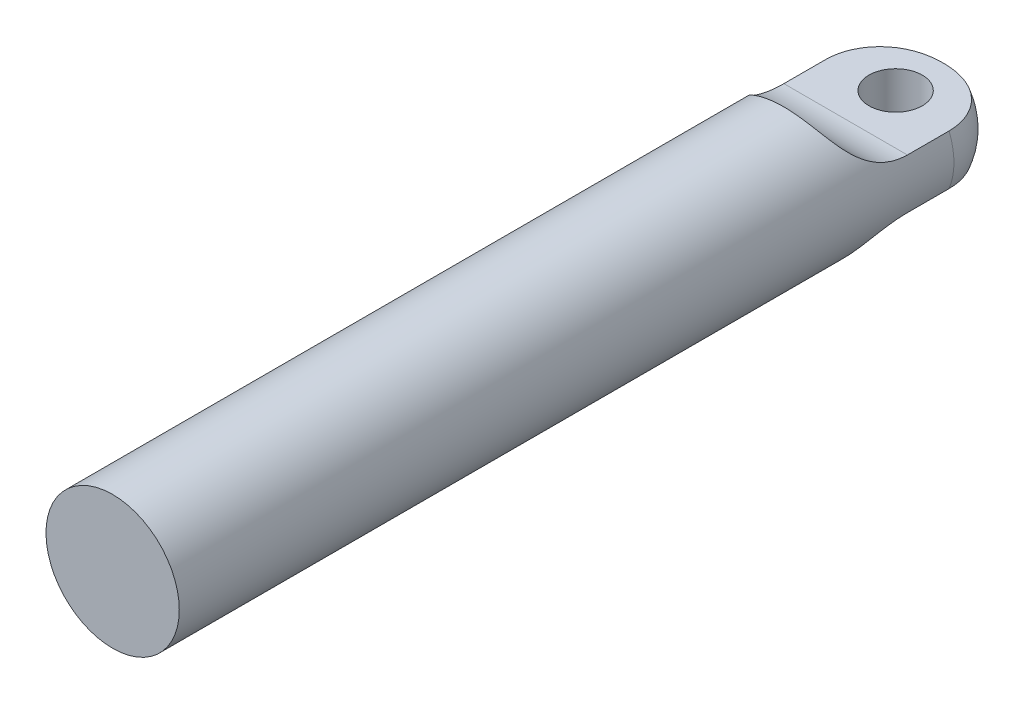
ISO-10303-21;
HEADER;
FILE_DESCRIPTION(('STEP AP214'),'2;1');
FILE_NAME('part.step','',(''),(''),'','','');
FILE_SCHEMA(('AUTOMOTIVE_DESIGN { 1 0 10303 214 1 1 1 1 }'));
ENDSEC;
DATA;
#1=APPLICATION_CONTEXT('core data for automotive mechanical design processes');
#2=APPLICATION_PROTOCOL_DEFINITION('international standard','automotive_design',2000,#1);
#3=PRODUCT_CONTEXT('',#1,'mechanical');
#4=PRODUCT('Part','Part','',(#3));
#5=PRODUCT_RELATED_PRODUCT_CATEGORY('part','',(#4));
#6=PRODUCT_DEFINITION_FORMATION('','',#4);
#7=PRODUCT_DEFINITION_CONTEXT('part definition',#1,'design');
#8=PRODUCT_DEFINITION('design','',#6,#7);
#9=PRODUCT_DEFINITION_SHAPE('','',#8);
#10=(LENGTH_UNIT() NAMED_UNIT(*) SI_UNIT(.MILLI.,.METRE.));
#11=(NAMED_UNIT(*) PLANE_ANGLE_UNIT() SI_UNIT($,.RADIAN.));
#12=(NAMED_UNIT(*) SI_UNIT($,.STERADIAN.) SOLID_ANGLE_UNIT());
#13=UNCERTAINTY_MEASURE_WITH_UNIT(LENGTH_MEASURE(1.E-05),#10,'distance_accuracy_value','');
#14=(GEOMETRIC_REPRESENTATION_CONTEXT(3) GLOBAL_UNCERTAINTY_ASSIGNED_CONTEXT((#13)) GLOBAL_UNIT_ASSIGNED_CONTEXT((#10,
#11,#12)) REPRESENTATION_CONTEXT('',''));
#15=CARTESIAN_POINT('',(0.,0.,0.));
#16=DIRECTION('',(0.,0.,1.));
#17=DIRECTION('',(1.,0.,0.));
#18=AXIS2_PLACEMENT_3D('',#15,#16,#17);
#19=CARTESIAN_POINT('',(0.,0.,25.));
#20=DIRECTION('',(0.,0.,-1.));
#21=DIRECTION('',(-1.,0.,0.));
#22=AXIS2_PLACEMENT_3D('',#19,#20,#21);
#23=CYLINDRICAL_SURFACE('',#22,4.);
#24=CARTESIAN_POINT('',(0.,0.,25.));
#25=DIRECTION('',(0.,0.,1.));
#26=DIRECTION('',(1.,0.,0.));
#27=AXIS2_PLACEMENT_3D('',#24,#25,#26);
#28=CIRCLE('',#27,4.);
#29=CARTESIAN_POINT('',(4.,0.,25.));
#30=VERTEX_POINT('',#29);
#31=EDGE_CURVE('E101',#30,#30,#28,.T.);
#32=ORIENTED_EDGE('',*,*,#31,.F.);
#33=EDGE_LOOP('',(#32));
#34=FACE_BOUND('',#33,.T.);
#35=DIRECTION('',(0.,0.,-1.));
#36=VECTOR('',#35,1.);
#37=CARTESIAN_POINT('',(3.70809924354783,-1.49999999999999,25.));
#38=LINE('',#37,#36);
#39=CARTESIAN_POINT('',(3.70809924354783,-1.49999999999999,-19.));
#40=VERTEX_POINT('',#39);
#41=CARTESIAN_POINT('',(3.70809924354783,-1.49999999999999,-21.5000000000012));
#42=VERTEX_POINT('',#41);
#43=EDGE_CURVE('E84',#40,#42,#38,.T.);
#44=ORIENTED_EDGE('',*,*,#43,.T.);
#45=CARTESIAN_POINT('',(0.,0.,-21.5));
#46=DIRECTION('',(0.,0.,1.));
#47=DIRECTION('',(1.,0.,0.));
#48=AXIS2_PLACEMENT_3D('',#45,#46,#47);
#49=CIRCLE('',#48,4.);
#50=CARTESIAN_POINT('',(3.70809924354783,1.49999999999999,-21.5));
#51=VERTEX_POINT('',#50);
#52=EDGE_CURVE('E172',#42,#51,#49,.T.);
#53=ORIENTED_EDGE('',*,*,#52,.T.);
#54=DIRECTION('',(0.,0.,-1.));
#55=VECTOR('',#54,1.);
#56=CARTESIAN_POINT('',(3.70809924354783,1.49999999999999,25.));
#57=LINE('',#56,#55);
#58=CARTESIAN_POINT('',(3.70809924354783,1.5,-19.));
#59=VERTEX_POINT('',#58);
#60=EDGE_CURVE('E97',#51,#59,#57,.F.);
#61=ORIENTED_EDGE('',*,*,#60,.T.);
#62=CARTESIAN_POINT('',(3.70809924354783,1.5,-19.));
#63=CARTESIAN_POINT('',(3.70807573141707,1.4999867045356,-18.8995519770718));
#64=CARTESIAN_POINT('',(3.70656787967163,1.50378316425376,-18.7991016473895));
#65=CARTESIAN_POINT('',(3.7004132093745,1.51890292125169,-18.5988495999316));
#66=CARTESIAN_POINT('',(3.69576587355285,1.53022745887322,-18.4990479917772));
#67=CARTESIAN_POINT('',(3.68314305806879,1.56035547785143,-18.30048466203));
#68=CARTESIAN_POINT('',(3.6751576990941,1.57918115198815,-18.2017269269216));
#69=CARTESIAN_POINT('',(3.65552611735579,1.62411009038121,-18.0062539467445));
#70=CARTESIAN_POINT('',(3.64388008648036,1.65021297316655,-17.9095385948999));
#71=CARTESIAN_POINT('',(3.61646295948721,1.70946243568066,-17.7186603632832));
#72=CARTESIAN_POINT('',(3.60068335632793,1.74262351473543,-17.624503194626));
#73=CARTESIAN_POINT('',(3.56447865743165,1.81552956246726,-17.4396980421763));
#74=CARTESIAN_POINT('',(3.5440539418243,1.85527399232799,-17.3490497719455));
#75=CARTESIAN_POINT('',(3.49800301857775,1.9407020056598,-17.1721518425613));
#76=CARTESIAN_POINT('',(3.47238520720236,1.98637595987267,-17.0858953608504));
#77=CARTESIAN_POINT('',(3.41532464021781,2.08295482787731,-16.918378888951));
#78=CARTESIAN_POINT('',(3.38388233359743,2.13385933833028,-16.8371185142739));
#79=CARTESIAN_POINT('',(3.31631987876816,2.23733046323938,-16.684165497106));
#80=CARTESIAN_POINT('',(3.2805062159358,2.28969188747336,-16.6121987788628));
#81=CARTESIAN_POINT('',(3.20271856607924,2.39728970279654,-16.4739637636468));
#82=CARTESIAN_POINT('',(3.16074480380171,2.45252598895111,-16.4076952589188));
#83=CARTESIAN_POINT('',(3.07040476715984,2.56472176521923,-16.2813090185243));
#84=CARTESIAN_POINT('',(3.02204096719011,2.62168058177264,-16.2211889179356));
#85=CARTESIAN_POINT('',(2.91883635411959,2.73611529488793,-16.1073445493086));
#86=CARTESIAN_POINT('',(2.86399601260519,2.79359115352043,-16.0536198161659));
#87=CARTESIAN_POINT('',(2.75341703443147,2.9024363019235,-15.9573964905092));
#88=CARTESIAN_POINT('',(2.69824690570962,2.95387196247428,-15.9143174029692));
#89=CARTESIAN_POINT('',(2.58288776713917,3.05525580849013,-15.8333874667218));
#90=CARTESIAN_POINT('',(2.52269706007911,3.10520348313278,-15.7955383976082));
#91=CARTESIAN_POINT('',(2.39764859050589,3.20274378036323,-15.7249059758699));
#92=CARTESIAN_POINT('',(2.33279180194646,3.25033689094048,-15.6921215705657));
#93=CARTESIAN_POINT('',(2.19877370655007,3.34245569222235,-15.6313132355403));
#94=CARTESIAN_POINT('',(2.12961073653957,3.38698018357145,-15.6032911609515));
#95=CARTESIAN_POINT('',(1.98669105561387,3.4727618124838,-15.5513992041531));
#96=CARTESIAN_POINT('',(1.91289340281633,3.51397928722385,-15.5275765131591));
#97=CARTESIAN_POINT('',(1.76186040442236,3.59208744951429,-15.4840557418326));
#98=CARTESIAN_POINT('',(1.68462383794137,3.62897658324435,-15.4643591407341));
#99=CARTESIAN_POINT('',(1.44848334685023,3.73247302591917,-15.4108597554377));
#100=CARTESIAN_POINT('',(1.28509175361291,3.79194380278587,-15.3826276302763));
#101=CARTESIAN_POINT('',(0.934159155157906,3.89409724252793,-15.3360463623339));
#102=CARTESIAN_POINT('',(0.745819179204416,3.93456910001758,-15.3189338648535));
#103=CARTESIAN_POINT('',(0.364649611142521,3.98798472425337,-15.2966687310781));
#104=CARTESIAN_POINT('',(0.171822107985326,4.00094105027619,-15.2915106381784));
#105=CARTESIAN_POINT('',(-0.169903648983014,3.9991756129387,-15.2922415459062));
#106=CARTESIAN_POINT('',(-0.318869394151568,3.99005321914472,-15.2958950102069));
#107=CARTESIAN_POINT('',(-0.614587922896568,3.95530123713321,-15.3102466849927));
#108=CARTESIAN_POINT('',(-0.761340667244518,3.92967135664888,-15.320945020208));
#109=CARTESIAN_POINT('',(-0.997511915446244,3.87477233661154,-15.3449821881856));
#110=CARTESIAN_POINT('',(-1.08831085835771,3.85024401346958,-15.3559329140713));
#111=CARTESIAN_POINT('',(-1.26749148326014,3.79502873065444,-15.3814363616389));
#112=CARTESIAN_POINT('',(-1.35587375280485,3.7643432833351,-15.3959881989962));
#113=CARTESIAN_POINT('',(-1.52969830542524,3.69712265291268,-15.4291406034861));
#114=CARTESIAN_POINT('',(-1.61513787520483,3.66058223790808,-15.4477447971312));
#115=CARTESIAN_POINT('',(-1.78233925715018,3.58214854118576,-15.4894704826121));
#116=CARTESIAN_POINT('',(-1.86410266690132,3.54025761569487,-15.5125899883781));
#117=CARTESIAN_POINT('',(-2.02371654138577,3.45151340124114,-15.5639643047581));
#118=CARTESIAN_POINT('',(-2.10154838230373,3.40463926367507,-15.5922410754983));
#119=CARTESIAN_POINT('',(-2.25230655112033,3.3068395017459,-15.6543460375444));
#120=CARTESIAN_POINT('',(-2.3252328505559,3.25591385387877,-15.6881742610572));
#121=CARTESIAN_POINT('',(-2.46556981254429,3.15097383423486,-15.7617631975285));
#122=CARTESIAN_POINT('',(-2.53298483553983,3.09696196286247,-15.8015191488262));
#123=CARTESIAN_POINT('',(-2.66190538599132,2.98687856651431,-15.887270502731));
#124=CARTESIAN_POINT('',(-2.72341135463983,2.93080719574141,-15.9332654388923));
#125=CARTESIAN_POINT('',(-2.83647657895561,2.82138130587724,-16.0284817228068));
#126=CARTESIAN_POINT('',(-2.88841997831233,2.76808147523495,-16.0773104396292));
#127=CARTESIAN_POINT('',(-2.98673508455589,2.66170240538726,-16.1805042284561));
#128=CARTESIAN_POINT('',(-3.03310684384691,2.60862316411164,-16.2348692483799));
#129=CARTESIAN_POINT('',(-3.12029966679309,2.50367458885207,-16.3489547712633));
#130=CARTESIAN_POINT('',(-3.1611205466619,2.45180529497585,-16.408675451437));
#131=CARTESIAN_POINT('',(-3.237367549743,2.35020991548017,-16.5331643545017));
#132=CARTESIAN_POINT('',(-3.27279364636272,2.30048384042617,-16.5979326022714));
#133=CARTESIAN_POINT('',(-3.3374865321062,2.20553426730389,-16.7300008109672));
#134=CARTESIAN_POINT('',(-3.3669123664715,2.16021821654322,-16.7971564556944));
#135=CARTESIAN_POINT('',(-3.42128673228854,2.07302557465719,-16.9354074966051));
#136=CARTESIAN_POINT('',(-3.44623377581577,2.03115012905131,-17.006504191839));
#137=CARTESIAN_POINT('',(-3.51490184699396,1.91153119326241,-17.225066957903));
#138=CARTESIAN_POINT('',(-3.55246830291268,1.83976665934518,-17.3778448070136));
#139=CARTESIAN_POINT('',(-3.61661197068619,1.71049045894709,-17.7064159908429));
#140=CARTESIAN_POINT('',(-3.64203968707475,1.65462367104275,-17.8830698100523));
#141=CARTESIAN_POINT('',(-3.68025340232653,1.5678014840301,-18.2436097071659));
#142=CARTESIAN_POINT('',(-3.69305089059938,1.53682344901133,-18.4274890535274));
#143=CARTESIAN_POINT('',(-3.70300819227213,1.51253140933479,-18.6770379645347));
#144=CARTESIAN_POINT('',(-3.7049232929173,1.50782989814793,-18.7415878225049));
#145=CARTESIAN_POINT('',(-3.70746654370156,1.50156819973754,-18.8707508641346));
#146=CARTESIAN_POINT('',(-3.70809695994487,1.50000248125276,-18.9353637347999));
#147=CARTESIAN_POINT('',(-3.70809924354783,1.5,-19.));
#148=B_SPLINE_CURVE_WITH_KNOTS('',3,(#62,#63,#64,#65,#66,#67,#68,#69,#70,#71,#72,#73,#74,#75,
#76,#77,#78,#79,#80,#81,#82,#83,#84,#85,#86,#87,#88,#89,#90,#91,#92,#93,#94,#95,#96,#97,#98,#99,
#100,#101,#102,#103,#104,#105,#106,#107,#108,#109,#110,#111,#112,#113,#114,#115,#116,#117,#118,
#119,#120,#121,#122,#123,#124,#125,#126,#127,#128,#129,#130,#131,#132,#133,#134,#135,#136,#137,
#138,#139,#140,#141,#142,#143,#144,#145,#146,#147),.UNSPECIFIED.,.F.,.F.,(4,2,2,2,2,2,2,2,2,2,2,
2,2,2,2,2,2,2,2,2,2,2,2,2,2,2,2,2,2,2,2,2,2,2,2,2,2,2,2,2,2,2,4),(0.,0.301264994089726,
0.602579637533036,0.904792446373277,1.20698941620735,1.50981327238107,1.81261235607988,
2.11492572006493,2.41721578952253,2.70462443446329,2.99202259611825,3.27930979385647,
3.56657608579281,3.82685219127674,4.08721664274643,4.34752690500005,4.60793833800442,
4.87111174610836,5.13437934298134,5.66070869734235,6.23851490284462,6.81605731591085,
7.26291953217406,7.70978966039766,7.99359326545028,8.27732724591815,8.56131619497452,
8.84518051105148,9.13028303303994,9.41538720911573,9.70026358668678,9.98511867774259,
10.2518136019661,10.5185060175878,10.7852072610895,11.0519098192022,11.3101991135654,
11.5685740575343,12.085170378241,12.644000432083,13.2023216620362,13.3965043282361,
13.5903441706331),.UNSPECIFIED.);
#149=CARTESIAN_POINT('',(-3.70809924354783,1.49999999999999,-19.));
#150=VERTEX_POINT('',#149);
#151=EDGE_CURVE('E91',#59,#150,#148,.T.);
#152=ORIENTED_EDGE('',*,*,#151,.T.);
#153=DIRECTION('',(0.,0.,-1.));
#154=VECTOR('',#153,1.);
#155=CARTESIAN_POINT('',(-3.70809924354783,1.49999999999999,25.));
#156=LINE('',#155,#154);
#157=CARTESIAN_POINT('',(-3.70809924354783,1.49999999999999,-21.5));
#158=VERTEX_POINT('',#157);
#159=EDGE_CURVE('E108',#150,#158,#156,.T.);
#160=ORIENTED_EDGE('',*,*,#159,.T.);
#161=CARTESIAN_POINT('',(0.,0.,-21.5));
#162=DIRECTION('',(0.,0.,1.));
#163=DIRECTION('',(1.,0.,0.));
#164=AXIS2_PLACEMENT_3D('',#161,#162,#163);
#165=CIRCLE('',#164,4.);
#166=CARTESIAN_POINT('',(-3.70809924354783,-1.49999999999999,-21.5));
#167=VERTEX_POINT('',#166);
#168=EDGE_CURVE('E174',#158,#167,#165,.T.);
#169=ORIENTED_EDGE('',*,*,#168,.T.);
#170=DIRECTION('',(0.,0.,-1.));
#171=VECTOR('',#170,1.);
#172=CARTESIAN_POINT('',(-3.70809924354783,-1.49999999999999,25.));
#173=LINE('',#172,#171);
#174=CARTESIAN_POINT('',(-3.70809924354783,-1.5,-19.));
#175=VERTEX_POINT('',#174);
#176=EDGE_CURVE('E86',#167,#175,#173,.F.);
#177=ORIENTED_EDGE('',*,*,#176,.T.);
#178=CARTESIAN_POINT('',(-3.70809924354783,-1.5,-19.));
#179=CARTESIAN_POINT('',(-3.70807573141707,-1.4999867045356,-18.8995519770718));
#180=CARTESIAN_POINT('',(-3.70656787967163,-1.50378316425376,-18.7991016473895));
#181=CARTESIAN_POINT('',(-3.7004132093745,-1.51890292125169,-18.5988495999316));
#182=CARTESIAN_POINT('',(-3.69576587355285,-1.53022745887322,-18.4990479917772));
#183=CARTESIAN_POINT('',(-3.68314305806879,-1.56035547785143,-18.30048466203));
#184=CARTESIAN_POINT('',(-3.6751576990941,-1.57918115198815,-18.2017269269216));
#185=CARTESIAN_POINT('',(-3.65552611735579,-1.62411009038121,-18.0062539467445));
#186=CARTESIAN_POINT('',(-3.64388008648036,-1.65021297316655,-17.9095385948999));
#187=CARTESIAN_POINT('',(-3.61646295948721,-1.70946243568066,-17.7186603632832));
#188=CARTESIAN_POINT('',(-3.60068335632793,-1.74262351473543,-17.624503194626));
#189=CARTESIAN_POINT('',(-3.56447865743165,-1.81552956246726,-17.4396980421763));
#190=CARTESIAN_POINT('',(-3.5440539418243,-1.85527399232799,-17.3490497719455));
#191=CARTESIAN_POINT('',(-3.49800301857775,-1.9407020056598,-17.1721518425613));
#192=CARTESIAN_POINT('',(-3.47238520720236,-1.98637595987267,-17.0858953608504));
#193=CARTESIAN_POINT('',(-3.41532464021781,-2.08295482787731,-16.918378888951));
#194=CARTESIAN_POINT('',(-3.38388233359743,-2.13385933833028,-16.8371185142739));
#195=CARTESIAN_POINT('',(-3.31631987876816,-2.23733046323938,-16.684165497106));
#196=CARTESIAN_POINT('',(-3.2805062159358,-2.28969188747336,-16.6121987788628));
#197=CARTESIAN_POINT('',(-3.20271856607924,-2.39728970279654,-16.4739637636468));
#198=CARTESIAN_POINT('',(-3.16074480380171,-2.45252598895111,-16.4076952589188));
#199=CARTESIAN_POINT('',(-3.07040476715984,-2.56472176521923,-16.2813090185243));
#200=CARTESIAN_POINT('',(-3.02204096719011,-2.62168058177264,-16.2211889179356));
#201=CARTESIAN_POINT('',(-2.91883635411959,-2.73611529488793,-16.1073445493086));
#202=CARTESIAN_POINT('',(-2.86399601260519,-2.79359115352043,-16.0536198161659));
#203=CARTESIAN_POINT('',(-2.75341703443147,-2.9024363019235,-15.9573964905092));
#204=CARTESIAN_POINT('',(-2.69824690570962,-2.95387196247428,-15.9143174029692));
#205=CARTESIAN_POINT('',(-2.58288776713917,-3.05525580849013,-15.8333874667218));
#206=CARTESIAN_POINT('',(-2.52269706007911,-3.10520348313278,-15.7955383976082));
#207=CARTESIAN_POINT('',(-2.39764859050589,-3.20274378036323,-15.7249059758699));
#208=CARTESIAN_POINT('',(-2.33279180194646,-3.25033689094048,-15.6921215705657));
#209=CARTESIAN_POINT('',(-2.19877370655007,-3.34245569222235,-15.6313132355403));
#210=CARTESIAN_POINT('',(-2.12961073653957,-3.38698018357145,-15.6032911609515));
#211=CARTESIAN_POINT('',(-1.98669105561387,-3.4727618124838,-15.5513992041531));
#212=CARTESIAN_POINT('',(-1.91289340281633,-3.51397928722385,-15.5275765131591));
#213=CARTESIAN_POINT('',(-1.76186040442236,-3.59208744951429,-15.4840557418326));
#214=CARTESIAN_POINT('',(-1.68462383794137,-3.62897658324435,-15.4643591407341));
#215=CARTESIAN_POINT('',(-1.44848334685023,-3.73247302591917,-15.4108597554377));
#216=CARTESIAN_POINT('',(-1.28509175361291,-3.79194380278587,-15.3826276302763));
#217=CARTESIAN_POINT('',(-0.934159155157906,-3.89409724252793,-15.3360463623339));
#218=CARTESIAN_POINT('',(-0.745819179204416,-3.93456910001758,-15.3189338648535));
#219=CARTESIAN_POINT('',(-0.364649611142521,-3.98798472425337,-15.2966687310781));
#220=CARTESIAN_POINT('',(-0.171822107985326,-4.00094105027619,-15.2915106381784));
#221=CARTESIAN_POINT('',(0.169903648983014,-3.9991756129387,-15.2922415459062));
#222=CARTESIAN_POINT('',(0.318869394151568,-3.99005321914472,-15.2958950102069));
#223=CARTESIAN_POINT('',(0.614587922896568,-3.95530123713321,-15.3102466849927));
#224=CARTESIAN_POINT('',(0.761340667244518,-3.92967135664888,-15.320945020208));
#225=CARTESIAN_POINT('',(0.997511915446244,-3.87477233661154,-15.3449821881856));
#226=CARTESIAN_POINT('',(1.08831085835771,-3.85024401346958,-15.3559329140713));
#227=CARTESIAN_POINT('',(1.26749148326014,-3.79502873065444,-15.3814363616389));
#228=CARTESIAN_POINT('',(1.35587375280485,-3.7643432833351,-15.3959881989962));
#229=CARTESIAN_POINT('',(1.52969830542524,-3.69712265291268,-15.4291406034861));
#230=CARTESIAN_POINT('',(1.61513787520483,-3.66058223790808,-15.4477447971312));
#231=CARTESIAN_POINT('',(1.78233925715018,-3.58214854118576,-15.4894704826121));
#232=CARTESIAN_POINT('',(1.86410266690132,-3.54025761569487,-15.5125899883781));
#233=CARTESIAN_POINT('',(2.02371654138577,-3.45151340124114,-15.5639643047581));
#234=CARTESIAN_POINT('',(2.10154838230373,-3.40463926367507,-15.5922410754983));
#235=CARTESIAN_POINT('',(2.25230655112033,-3.3068395017459,-15.6543460375444));
#236=CARTESIAN_POINT('',(2.3252328505559,-3.25591385387877,-15.6881742610572));
#237=CARTESIAN_POINT('',(2.46556981254429,-3.15097383423486,-15.7617631975285));
#238=CARTESIAN_POINT('',(2.53298483553983,-3.09696196286247,-15.8015191488262));
#239=CARTESIAN_POINT('',(2.66190538599132,-2.98687856651431,-15.887270502731));
#240=CARTESIAN_POINT('',(2.72341135463983,-2.93080719574141,-15.9332654388923));
#241=CARTESIAN_POINT('',(2.83647657895561,-2.82138130587724,-16.0284817228068));
#242=CARTESIAN_POINT('',(2.88841997831233,-2.76808147523495,-16.0773104396292));
#243=CARTESIAN_POINT('',(2.98673508455589,-2.66170240538726,-16.1805042284561));
#244=CARTESIAN_POINT('',(3.03310684384691,-2.60862316411164,-16.2348692483799));
#245=CARTESIAN_POINT('',(3.12029966679309,-2.50367458885207,-16.3489547712633));
#246=CARTESIAN_POINT('',(3.1611205466619,-2.45180529497585,-16.408675451437));
#247=CARTESIAN_POINT('',(3.237367549743,-2.35020991548017,-16.5331643545017));
#248=CARTESIAN_POINT('',(3.27279364636272,-2.30048384042617,-16.5979326022714));
#249=CARTESIAN_POINT('',(3.3374865321062,-2.20553426730389,-16.7300008109672));
#250=CARTESIAN_POINT('',(3.3669123664715,-2.16021821654322,-16.7971564556944));
#251=CARTESIAN_POINT('',(3.42128673228854,-2.07302557465719,-16.9354074966051));
#252=CARTESIAN_POINT('',(3.44623377581577,-2.03115012905131,-17.006504191839));
#253=CARTESIAN_POINT('',(3.51490184699396,-1.91153119326241,-17.225066957903));
#254=CARTESIAN_POINT('',(3.55246830291268,-1.83976665934518,-17.3778448070136));
#255=CARTESIAN_POINT('',(3.61661197068619,-1.71049045894709,-17.7064159908429));
#256=CARTESIAN_POINT('',(3.64203968707475,-1.65462367104275,-17.8830698100523));
#257=CARTESIAN_POINT('',(3.68025340232653,-1.5678014840301,-18.2436097071659));
#258=CARTESIAN_POINT('',(3.69305089059938,-1.53682344901133,-18.4274890535274));
#259=CARTESIAN_POINT('',(3.70300819227213,-1.51253140933479,-18.6770379645347));
#260=CARTESIAN_POINT('',(3.7049232929173,-1.50782989814793,-18.7415878225049));
#261=CARTESIAN_POINT('',(3.70746654370156,-1.50156819973754,-18.8707508641346));
#262=CARTESIAN_POINT('',(3.70809695994487,-1.50000248125276,-18.9353637347999));
#263=CARTESIAN_POINT('',(3.70809924354783,-1.5,-19.));
#264=B_SPLINE_CURVE_WITH_KNOTS('',3,(#178,#179,#180,#181,#182,#183,#184,#185,#186,#187,#188,
#189,#190,#191,#192,#193,#194,#195,#196,#197,#198,#199,#200,#201,#202,#203,#204,#205,#206,#207,
#208,#209,#210,#211,#212,#213,#214,#215,#216,#217,#218,#219,#220,#221,#222,#223,#224,#225,#226,
#227,#228,#229,#230,#231,#232,#233,#234,#235,#236,#237,#238,#239,#240,#241,#242,#243,#244,#245,
#246,#247,#248,#249,#250,#251,#252,#253,#254,#255,#256,#257,#258,#259,#260,#261,#262,#263),
.UNSPECIFIED.,.F.,.F.,(4,2,2,2,2,2,2,2,2,2,2,2,2,2,2,2,2,2,2,2,2,2,2,2,2,2,2,2,2,2,2,2,2,2,2,2,
2,2,2,2,2,2,4),(0.,0.301264994089726,0.602579637533036,0.904792446373277,1.20698941620735,
1.50981327238107,1.81261235607988,2.11492572006493,2.41721578952253,2.70462443446329,
2.99202259611825,3.27930979385647,3.56657608579281,3.82685219127674,4.08721664274643,
4.34752690500005,4.60793833800442,4.87111174610836,5.13437934298134,5.66070869734235,
6.23851490284462,6.81605731591085,7.26291953217406,7.70978966039766,7.99359326545028,
8.27732724591815,8.56131619497452,8.84518051105148,9.13028303303994,9.41538720911573,
9.70026358668678,9.98511867774259,10.2518136019661,10.5185060175878,10.7852072610895,
11.0519098192022,11.3101991135654,11.5685740575343,12.085170378241,12.644000432083,
13.2023216620362,13.3965043282361,13.5903441706331),.UNSPECIFIED.);
#265=EDGE_CURVE('E82',#175,#40,#264,.T.);
#266=ORIENTED_EDGE('',*,*,#265,.T.);
#267=EDGE_LOOP('',(#44,#53,#61,#152,#160,#169,#177,#266));
#268=FACE_BOUND('',#267,.T.);
#269=ADVANCED_FACE('F39',(#34,#268),#23,.T.);
#270=CARTESIAN_POINT('',(0.,0.,25.));
#271=DIRECTION('',(0.,0.,1.));
#272=DIRECTION('',(1.,0.,0.));
#273=AXIS2_PLACEMENT_3D('',#270,#271,#272);
#274=PLANE('',#273);
#275=ORIENTED_EDGE('',*,*,#31,.T.);
#276=EDGE_LOOP('',(#275));
#277=FACE_BOUND('',#276,.T.);
#278=ADVANCED_FACE('F140',(#277),#274,.T.);
#279=CARTESIAN_POINT('',(0.,0.,-25.));
#280=DIRECTION('',(0.,0.,1.));
#281=DIRECTION('',(1.,0.,0.));
#282=AXIS2_PLACEMENT_3D('',#279,#280,#281);
#283=PLANE('',#282);
#284=CARTESIAN_POINT('',(0.,0.,-25.));
#285=DIRECTION('',(0.,0.,1.));
#286=DIRECTION('',(1.,0.,0.));
#287=AXIS2_PLACEMENT_3D('',#284,#285,#286);
#288=CIRCLE('',#287,0.5);
#289=CARTESIAN_POINT('',(0.463512405443479,-0.187499999999999,-25.));
#290=VERTEX_POINT('',#289);
#291=EDGE_CURVE('E11',#290,#290,#288,.F.);
#292=ORIENTED_EDGE('',*,*,#291,.T.);
#293=EDGE_LOOP('',(#292));
#294=FACE_BOUND('',#293,.T.);
#295=ADVANCED_FACE('F145',(#294),#283,.F.);
#296=CARTESIAN_POINT('',(-4.,-1.5,-25.));
#297=DIRECTION('',(0.,1.,0.));
#298=DIRECTION('',(0.,0.,1.));
#299=AXIS2_PLACEMENT_3D('',#296,#297,#298);
#300=PLANE('',#299);
#301=CARTESIAN_POINT('',(0.,-1.5,-22.));
#302=DIRECTION('',(0.,1.,0.));
#303=DIRECTION('',(0.,0.,1.));
#304=AXIS2_PLACEMENT_3D('',#301,#302,#303);
#305=CIRCLE('',#304,1.59999999999999);
#306=CARTESIAN_POINT('',(0.,-1.5,-20.4));
#307=VERTEX_POINT('',#306);
#308=EDGE_CURVE('E189',#307,#307,#305,.T.);
#309=ORIENTED_EDGE('',*,*,#308,.T.);
#310=EDGE_LOOP('',(#309));
#311=FACE_BOUND('',#310,.T.);
#312=ORIENTED_EDGE('',*,*,#176,.F.);
#313=CARTESIAN_POINT('',(-3.70809924354783,-1.5,-21.5));
#314=CARTESIAN_POINT('',(-3.70810864499123,-1.5,-21.5915735819086));
#315=CARTESIAN_POINT('',(-3.70422252056121,-1.5,-21.6831427390931));
#316=CARTESIAN_POINT('',(-3.68873177869698,-1.5,-21.865619849874));
#317=CARTESIAN_POINT('',(-3.67712768273735,-1.5,-21.9565278477229));
#318=CARTESIAN_POINT('',(-3.64629318748178,-1.5,-22.1369278744418));
#319=CARTESIAN_POINT('',(-3.62707252048201,-1.5,-22.2264215593269));
#320=CARTESIAN_POINT('',(-3.58116876954334,-1.5,-22.4034476013965));
#321=CARTESIAN_POINT('',(-3.55448575385386,-1.5,-22.4909799765109));
#322=CARTESIAN_POINT('',(-3.46348081103655,-1.5,-22.7497764155653));
#323=CARTESIAN_POINT('',(-3.38818760252943,-1.5,-22.9173292078689));
#324=CARTESIAN_POINT('',(-3.21069590661251,-1.5,-23.2374067246187));
#325=CARTESIAN_POINT('',(-3.10849594007362,-1.5,-23.3899306222567));
#326=CARTESIAN_POINT('',(-2.87967598354563,-1.5,-23.6766467011696));
#327=CARTESIAN_POINT('',(-2.75293650922502,-1.5,-23.8107434623506));
#328=CARTESIAN_POINT('',(-2.4791307780251,-1.5,-24.0562609318309));
#329=CARTESIAN_POINT('',(-2.33207004217855,-1.5,-24.167687779002));
#330=CARTESIAN_POINT('',(-2.09797002409376,-1.5,-24.3170995740401));
#331=CARTESIAN_POINT('',(-2.01669781115898,-1.5,-24.3643733420127));
#332=CARTESIAN_POINT('',(-1.85061996912954,-1.5,-24.4522284648079));
#333=CARTESIAN_POINT('',(-1.76581529848724,-1.5,-24.4928116203501));
#334=CARTESIAN_POINT('',(-1.59324122053923,-1.5,-24.5672319062042));
#335=CARTESIAN_POINT('',(-1.5054698860876,-1.5,-24.6010645489157));
#336=CARTESIAN_POINT('',(-1.32764927124291,-1.5,-24.6620087646871));
#337=CARTESIAN_POINT('',(-1.23760030008513,-1.5,-24.6891212448041));
#338=CARTESIAN_POINT('',(-1.02364077971276,-1.5,-24.7452570122343));
#339=CARTESIAN_POINT('',(-0.899014186127165,-1.5,-24.7715669798184));
#340=CARTESIAN_POINT('',(-0.647910102593711,-1.5,-24.8130910573004));
#341=CARTESIAN_POINT('',(-0.521431706101312,-1.5,-24.8282995337052));
#342=CARTESIAN_POINT('',(-0.26727235201515,-1.5,-24.8486633556548));
#343=CARTESIAN_POINT('',(-0.139588812523209,-1.5,-24.8537856121644));
#344=CARTESIAN_POINT('',(0.115791129134778,-1.5,-24.8543901806738));
#345=CARTESIAN_POINT('',(0.243487530197596,-1.5,-24.849873026266));
#346=CARTESIAN_POINT('',(0.500934973683141,-1.5,-24.8305312700335));
#347=CARTESIAN_POINT('',(0.630669865595143,-1.5,-24.8154833798956));
#348=CARTESIAN_POINT('',(0.888275432666268,-1.5,-24.77375327564));
#349=CARTESIAN_POINT('',(1.0161463411825,-1.5,-24.7470725310249));
#350=CARTESIAN_POINT('',(1.26806611053313,-1.5,-24.6812730957493));
#351=CARTESIAN_POINT('',(1.39212979872057,-1.5,-24.6422119527779));
#352=CARTESIAN_POINT('',(1.63538903415377,-1.5,-24.5512053128984));
#353=CARTESIAN_POINT('',(1.75458611024531,-1.5,-24.4992638991674));
#354=CARTESIAN_POINT('',(2.04044458784477,-1.5,-24.355329519107));
#355=CARTESIAN_POINT('',(2.20346634694808,-1.5,-24.2559354672155));
#356=CARTESIAN_POINT('',(2.51065918548325,-1.5,-24.0310793684502));
#357=CARTESIAN_POINT('',(2.65481135254099,-1.5,-23.9055914896739));
#358=CARTESIAN_POINT('',(2.91968598007339,-1.5,-23.631582343454));
#359=CARTESIAN_POINT('',(3.04037894050783,-1.5,-23.4830324921255));
#360=CARTESIAN_POINT('',(3.25412115115614,-1.5,-23.1673075115483));
#361=CARTESIAN_POINT('',(3.34718483960637,-1.5,-23.0001421732271));
#362=CARTESIAN_POINT('',(3.50037646967699,-1.5,-22.6574389027341));
#363=CARTESIAN_POINT('',(3.56141402941592,-1.5,-22.4823061737388));
#364=CARTESIAN_POINT('',(3.65287306316426,-1.5,-22.1240691747334));
#365=CARTESIAN_POINT('',(3.68328843358981,-1.5,-21.9409633231131));
#366=CARTESIAN_POINT('',(3.70516089917377,-1.5,-21.6656807997519));
#367=CARTESIAN_POINT('',(3.70853701592874,-1.5,-21.5743017107472));
#368=CARTESIAN_POINT('',(3.7075716659214,-1.5,-21.3915586341498));
#369=CARTESIAN_POINT('',(3.7032301749236,-1.5,-21.3001946466053));
#370=CARTESIAN_POINT('',(3.68684415210811,-1.5,-21.1181026894354));
#371=CARTESIAN_POINT('',(3.67479428266392,-1.5,-21.0273752045968));
#372=CARTESIAN_POINT('',(3.64309017702423,-1.5,-20.8472538279371));
#373=CARTESIAN_POINT('',(3.62343553145035,-1.5,-20.7578600081786));
#374=CARTESIAN_POINT('',(3.60003099096936,-1.5,-20.6694547145838));
#375=B_SPLINE_CURVE_WITH_KNOTS('',3,(#313,#314,#315,#316,#317,#318,#319,#320,#321,#322,#323,
#324,#325,#326,#327,#328,#329,#330,#331,#332,#333,#334,#335,#336,#337,#338,#339,#340,#341,#342,
#343,#344,#345,#346,#347,#348,#349,#350,#351,#352,#353,#354,#355,#356,#357,#358,#359,#360,#361,
#362,#363,#364,#365,#366,#367,#368,#369,#370,#371,#372,#373,#374),.UNSPECIFIED.,.F.,.F.,(4,2,2,
2,2,2,2,2,2,2,2,2,2,2,2,2,2,2,2,2,2,2,2,2,2,2,2,2,2,2,4),(0.,0.274630415778419,
0.549242277687203,0.823504371914157,1.09776395786691,1.64601437848738,2.19429494404513,
2.7453154880491,3.29618661992875,3.57799596001768,3.859729329337,4.14164936965011,
4.42353133692377,4.80507088710062,5.18680391659664,5.56978719362214,5.95274927104335,
6.34408767530065,6.73537665864037,7.12487285256495,7.51424572972206,8.0842903083005,
8.65490191928087,9.22622649901724,9.79725199386083,10.3510359394307,10.9049302428182,
11.1789886671149,11.4530479520346,11.7272972135974,12.0015612405314),.UNSPECIFIED.);
#376=EDGE_CURVE('E49',#167,#42,#375,.T.);
#377=ORIENTED_EDGE('',*,*,#376,.T.);
#378=ORIENTED_EDGE('',*,*,#43,.F.);
#379=DIRECTION('',(1.,0.,0.));
#380=VECTOR('',#379,1.);
#381=CARTESIAN_POINT('',(-3.70809924354783,-1.5,-19.));
#382=LINE('',#381,#380);
#383=EDGE_CURVE('E95',#40,#175,#382,.F.);
#384=ORIENTED_EDGE('',*,*,#383,.T.);
#385=EDGE_LOOP('',(#312,#377,#378,#384));
#386=FACE_BOUND('',#385,.T.);
#387=ADVANCED_FACE('F94',(#311,#386),#300,.F.);
#388=CARTESIAN_POINT('',(-4.,1.5,-25.));
#389=DIRECTION('',(0.,-1.,0.));
#390=DIRECTION('',(0.,0.,-1.));
#391=AXIS2_PLACEMENT_3D('',#388,#389,#390);
#392=PLANE('',#391);
#393=CARTESIAN_POINT('',(0.,1.5,-22.));
#394=DIRECTION('',(0.,1.,0.));
#395=DIRECTION('',(0.,0.,1.));
#396=AXIS2_PLACEMENT_3D('',#393,#394,#395);
#397=CIRCLE('',#396,1.59999999999999);
#398=CARTESIAN_POINT('',(0.,1.5,-20.4));
#399=VERTEX_POINT('',#398);
#400=EDGE_CURVE('E193',#399,#399,#397,.T.);
#401=ORIENTED_EDGE('',*,*,#400,.F.);
#402=EDGE_LOOP('',(#401));
#403=FACE_BOUND('',#402,.T.);
#404=ORIENTED_EDGE('',*,*,#60,.F.);
#405=CARTESIAN_POINT('',(3.70809924354783,1.5,-21.5));
#406=CARTESIAN_POINT('',(3.70810864499123,1.5,-21.5915735819086));
#407=CARTESIAN_POINT('',(3.70422252056121,1.5,-21.6831427390931));
#408=CARTESIAN_POINT('',(3.68873177869698,1.5,-21.865619849874));
#409=CARTESIAN_POINT('',(3.67712768273735,1.5,-21.9565278477229));
#410=CARTESIAN_POINT('',(3.64629318748178,1.5,-22.1369278744418));
#411=CARTESIAN_POINT('',(3.62707252048201,1.5,-22.2264215593269));
#412=CARTESIAN_POINT('',(3.58116876954334,1.5,-22.4034476013965));
#413=CARTESIAN_POINT('',(3.55448575385386,1.5,-22.4909799765109));
#414=CARTESIAN_POINT('',(3.46348081103655,1.5,-22.7497764155653));
#415=CARTESIAN_POINT('',(3.38818760252943,1.5,-22.9173292078689));
#416=CARTESIAN_POINT('',(3.21069590661251,1.5,-23.2374067246187));
#417=CARTESIAN_POINT('',(3.10849594007362,1.5,-23.3899306222567));
#418=CARTESIAN_POINT('',(2.87967598354563,1.5,-23.6766467011696));
#419=CARTESIAN_POINT('',(2.75293650922502,1.5,-23.8107434623506));
#420=CARTESIAN_POINT('',(2.4791307780251,1.5,-24.0562609318309));
#421=CARTESIAN_POINT('',(2.33207004217855,1.5,-24.167687779002));
#422=CARTESIAN_POINT('',(2.09797002409376,1.5,-24.3170995740401));
#423=CARTESIAN_POINT('',(2.01669781115898,1.5,-24.3643733420127));
#424=CARTESIAN_POINT('',(1.85061996912954,1.5,-24.4522284648079));
#425=CARTESIAN_POINT('',(1.76581529848724,1.5,-24.4928116203501));
#426=CARTESIAN_POINT('',(1.59324122053923,1.5,-24.5672319062042));
#427=CARTESIAN_POINT('',(1.5054698860876,1.5,-24.6010645489157));
#428=CARTESIAN_POINT('',(1.32764927124291,1.5,-24.6620087646871));
#429=CARTESIAN_POINT('',(1.23760030008513,1.5,-24.6891212448041));
#430=CARTESIAN_POINT('',(1.02364077971276,1.5,-24.7452570122343));
#431=CARTESIAN_POINT('',(0.899014186127165,1.5,-24.7715669798184));
#432=CARTESIAN_POINT('',(0.647910102593711,1.5,-24.8130910573004));
#433=CARTESIAN_POINT('',(0.521431706101312,1.5,-24.8282995337052));
#434=CARTESIAN_POINT('',(0.26727235201515,1.5,-24.8486633556548));
#435=CARTESIAN_POINT('',(0.139588812523209,1.5,-24.8537856121644));
#436=CARTESIAN_POINT('',(-0.115791129134778,1.5,-24.8543901806738));
#437=CARTESIAN_POINT('',(-0.243487530197596,1.5,-24.849873026266));
#438=CARTESIAN_POINT('',(-0.500934973683141,1.5,-24.8305312700335));
#439=CARTESIAN_POINT('',(-0.630669865595143,1.5,-24.8154833798956));
#440=CARTESIAN_POINT('',(-0.888275432666268,1.5,-24.77375327564));
#441=CARTESIAN_POINT('',(-1.0161463411825,1.5,-24.7470725310249));
#442=CARTESIAN_POINT('',(-1.26806611053313,1.5,-24.6812730957493));
#443=CARTESIAN_POINT('',(-1.39212979872057,1.5,-24.6422119527779));
#444=CARTESIAN_POINT('',(-1.63538903415377,1.5,-24.5512053128984));
#445=CARTESIAN_POINT('',(-1.75458611024531,1.5,-24.4992638991674));
#446=CARTESIAN_POINT('',(-2.04044458784477,1.5,-24.355329519107));
#447=CARTESIAN_POINT('',(-2.20346634694808,1.5,-24.2559354672155));
#448=CARTESIAN_POINT('',(-2.51065918548325,1.5,-24.0310793684502));
#449=CARTESIAN_POINT('',(-2.65481135254099,1.5,-23.9055914896739));
#450=CARTESIAN_POINT('',(-2.91968598007339,1.5,-23.631582343454));
#451=CARTESIAN_POINT('',(-3.04037894050783,1.5,-23.4830324921255));
#452=CARTESIAN_POINT('',(-3.25412115115614,1.5,-23.1673075115483));
#453=CARTESIAN_POINT('',(-3.34718483960637,1.5,-23.0001421732271));
#454=CARTESIAN_POINT('',(-3.50037646967699,1.5,-22.6574389027341));
#455=CARTESIAN_POINT('',(-3.56141402941592,1.5,-22.4823061737388));
#456=CARTESIAN_POINT('',(-3.65287306316426,1.5,-22.1240691747334));
#457=CARTESIAN_POINT('',(-3.68328843358981,1.5,-21.9409633231131));
#458=CARTESIAN_POINT('',(-3.70516089917377,1.5,-21.6656807997519));
#459=CARTESIAN_POINT('',(-3.70853701592874,1.5,-21.5743017107472));
#460=CARTESIAN_POINT('',(-3.7075716659214,1.5,-21.3915586341498));
#461=CARTESIAN_POINT('',(-3.7032301749236,1.5,-21.3001946466053));
#462=CARTESIAN_POINT('',(-3.68684415210811,1.5,-21.1181026894354));
#463=CARTESIAN_POINT('',(-3.67479428266392,1.5,-21.0273752045968));
#464=CARTESIAN_POINT('',(-3.64309017702423,1.5,-20.8472538279371));
#465=CARTESIAN_POINT('',(-3.62343553145035,1.5,-20.7578600081786));
#466=CARTESIAN_POINT('',(-3.60003099096936,1.5,-20.6694547145838));
#467=B_SPLINE_CURVE_WITH_KNOTS('',3,(#405,#406,#407,#408,#409,#410,#411,#412,#413,#414,#415,
#416,#417,#418,#419,#420,#421,#422,#423,#424,#425,#426,#427,#428,#429,#430,#431,#432,#433,#434,
#435,#436,#437,#438,#439,#440,#441,#442,#443,#444,#445,#446,#447,#448,#449,#450,#451,#452,#453,
#454,#455,#456,#457,#458,#459,#460,#461,#462,#463,#464,#465,#466),.UNSPECIFIED.,.F.,.F.,(4,2,2,
2,2,2,2,2,2,2,2,2,2,2,2,2,2,2,2,2,2,2,2,2,2,2,2,2,2,2,4),(0.,0.274630415778419,
0.549242277687203,0.823504371914157,1.09776395786691,1.64601437848738,2.19429494404513,
2.7453154880491,3.29618661992875,3.57799596001768,3.859729329337,4.14164936965011,
4.42353133692377,4.80507088710062,5.18680391659664,5.56978719362214,5.95274927104335,
6.34408767530065,6.73537665864037,7.12487285256495,7.51424572972206,8.0842903083005,
8.65490191928087,9.22622649901724,9.79725199386083,10.3510359394307,10.9049302428182,
11.1789886671149,11.4530479520346,11.7272972135974,12.0015612405314),.UNSPECIFIED.);
#468=EDGE_CURVE('E165',#51,#158,#467,.T.);
#469=ORIENTED_EDGE('',*,*,#468,.T.);
#470=ORIENTED_EDGE('',*,*,#159,.F.);
#471=DIRECTION('',(1.,0.,0.));
#472=VECTOR('',#471,1.);
#473=CARTESIAN_POINT('',(3.70809924354783,1.5,-19.));
#474=LINE('',#473,#472);
#475=EDGE_CURVE('E92',#150,#59,#474,.T.);
#476=ORIENTED_EDGE('',*,*,#475,.T.);
#477=EDGE_LOOP('',(#404,#469,#470,#476));
#478=FACE_BOUND('',#477,.T.);
#479=ADVANCED_FACE('F128',(#403,#478),#392,.F.);
#480=CARTESIAN_POINT('',(-4.,-5.5,-19.));
#481=DIRECTION('',(-1.,0.,0.));
#482=DIRECTION('',(0.,0.,1.));
#483=AXIS2_PLACEMENT_3D('',#480,#481,#482);
#484=CYLINDRICAL_SURFACE('',#483,4.);
#485=ORIENTED_EDGE('',*,*,#265,.F.);
#486=ORIENTED_EDGE('',*,*,#383,.F.);
#487=EDGE_LOOP('',(#485,#486));
#488=FACE_BOUND('',#487,.T.);
#489=ADVANCED_FACE('F99',(#488),#484,.F.);
#490=CARTESIAN_POINT('',(-4.,5.5,-19.));
#491=DIRECTION('',(-1.,0.,0.));
#492=DIRECTION('',(0.,0.,1.));
#493=AXIS2_PLACEMENT_3D('',#490,#491,#492);
#494=CYLINDRICAL_SURFACE('',#493,4.);
#495=ORIENTED_EDGE('',*,*,#475,.F.);
#496=ORIENTED_EDGE('',*,*,#151,.F.);
#497=EDGE_LOOP('',(#495,#496));
#498=FACE_BOUND('',#497,.T.);
#499=ADVANCED_FACE('F127',(#498),#494,.F.);
#500=CARTESIAN_POINT('',(0.,1.5,-22.));
#501=DIRECTION('',(0.,1.,0.));
#502=DIRECTION('',(0.,0.,1.));
#503=AXIS2_PLACEMENT_3D('',#500,#501,#502);
#504=CYLINDRICAL_SURFACE('',#503,1.59999999999999);
#505=ORIENTED_EDGE('',*,*,#400,.T.);
#506=EDGE_LOOP('',(#505));
#507=FACE_BOUND('',#506,.T.);
#508=ORIENTED_EDGE('',*,*,#308,.F.);
#509=EDGE_LOOP('',(#508));
#510=FACE_BOUND('',#509,.T.);
#511=ADVANCED_FACE('F131',(#507,#510),#504,.F.);
#512=CARTESIAN_POINT('',(0.,0.,-21.5));
#513=DIRECTION('',(0.,0.,1.));
#514=DIRECTION('',(1.,0.,0.));
#515=AXIS2_PLACEMENT_3D('',#512,#513,#514);
#516=DEGENERATE_TOROIDAL_SURFACE('',#515,0.5,3.5,.T.);
#517=ORIENTED_EDGE('',*,*,#291,.F.);
#518=EDGE_LOOP('',(#517));
#519=FACE_BOUND('',#518,.T.);
#520=ORIENTED_EDGE('',*,*,#468,.F.);
#521=ORIENTED_EDGE('',*,*,#52,.F.);
#522=ORIENTED_EDGE('',*,*,#376,.F.);
#523=ORIENTED_EDGE('',*,*,#168,.F.);
#524=EDGE_LOOP('',(#520,#521,#522,#523));
#525=FACE_BOUND('',#524,.T.);
#526=ADVANCED_FACE('F41',(#519,#525),#516,.T.);
#527=CLOSED_SHELL('',(#269,#278,#295,#387,#479,#489,#499,#511,#526));
#528=MANIFOLD_SOLID_BREP('B2',#527);
#529=ADVANCED_BREP_SHAPE_REPRESENTATION('',(#18,#528),#14);
#530=SHAPE_DEFINITION_REPRESENTATION(#9,#529);
ENDSEC;
END-ISO-10303-21;
